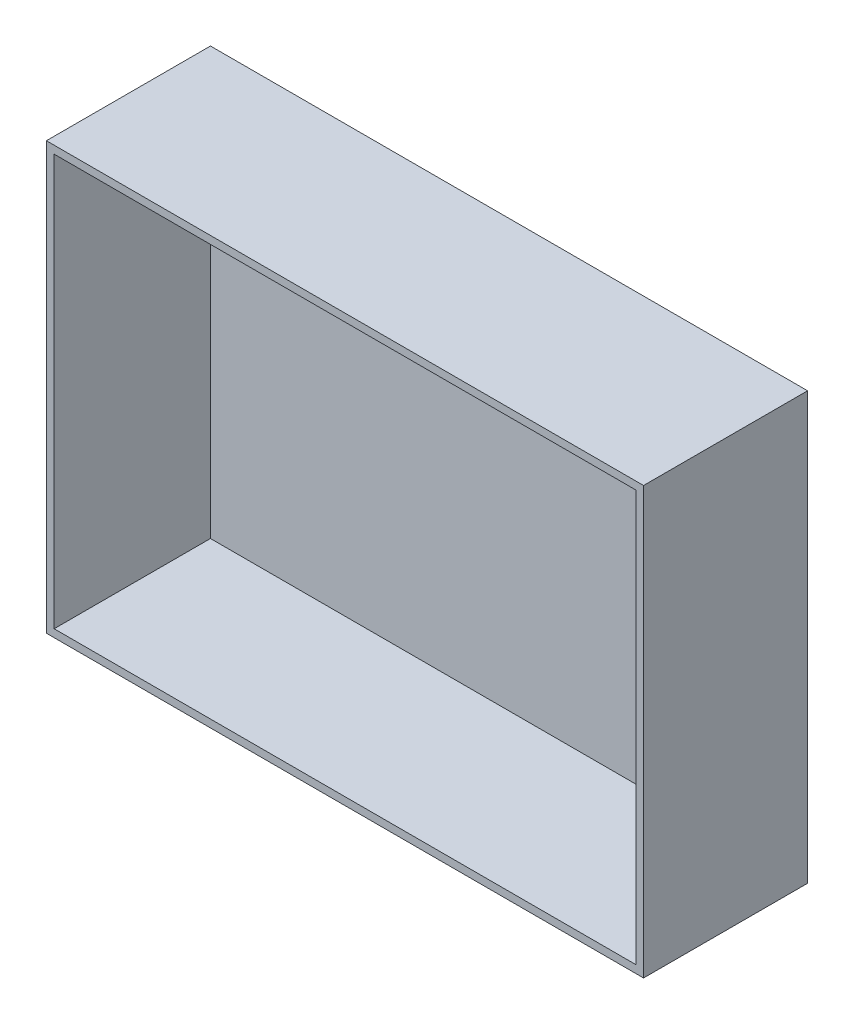
ISO-10303-21;
HEADER;
FILE_DESCRIPTION(('STEP AP214'),'2;1');
FILE_NAME('part.step','',(''),(''),'','','');
FILE_SCHEMA(('AUTOMOTIVE_DESIGN { 1 0 10303 214 1 1 1 1 }'));
ENDSEC;
DATA;
#1=APPLICATION_CONTEXT('core data for automotive mechanical design processes');
#2=APPLICATION_PROTOCOL_DEFINITION('international standard','automotive_design',2000,#1);
#3=PRODUCT_CONTEXT('',#1,'mechanical');
#4=PRODUCT('Part','Part','',(#3));
#5=PRODUCT_RELATED_PRODUCT_CATEGORY('part','',(#4));
#6=PRODUCT_DEFINITION_FORMATION('','',#4);
#7=PRODUCT_DEFINITION_CONTEXT('part definition',#1,'design');
#8=PRODUCT_DEFINITION('design','',#6,#7);
#9=PRODUCT_DEFINITION_SHAPE('','',#8);
#10=(LENGTH_UNIT() NAMED_UNIT(*) SI_UNIT(.MILLI.,.METRE.));
#11=(NAMED_UNIT(*) PLANE_ANGLE_UNIT() SI_UNIT($,.RADIAN.));
#12=(NAMED_UNIT(*) SI_UNIT($,.STERADIAN.) SOLID_ANGLE_UNIT());
#13=UNCERTAINTY_MEASURE_WITH_UNIT(LENGTH_MEASURE(1.E-05),#10,'distance_accuracy_value','');
#14=(GEOMETRIC_REPRESENTATION_CONTEXT(3) GLOBAL_UNCERTAINTY_ASSIGNED_CONTEXT((#13)) GLOBAL_UNIT_ASSIGNED_CONTEXT((#10,
#11,#12)) REPRESENTATION_CONTEXT('',''));
#15=CARTESIAN_POINT('',(0.,0.,0.));
#16=DIRECTION('',(0.,0.,1.));
#17=DIRECTION('',(1.,0.,0.));
#18=AXIS2_PLACEMENT_3D('',#15,#16,#17);
#19=CARTESIAN_POINT('',(0.,0.,63.5));
#20=DIRECTION('',(1.,0.,0.));
#21=DIRECTION('',(0.,0.,-1.));
#22=AXIS2_PLACEMENT_3D('',#19,#20,#21);
#23=PLANE('',#22);
#24=DIRECTION('',(0.,-1.,0.));
#25=VECTOR('',#24,1.);
#26=CARTESIAN_POINT('',(0.,0.,0.));
#27=LINE('',#26,#25);
#28=CARTESIAN_POINT('',(0.,165.1,0.));
#29=VERTEX_POINT('',#28);
#30=CARTESIAN_POINT('',(0.,0.,0.));
#31=VERTEX_POINT('',#30);
#32=EDGE_CURVE('E145',#29,#31,#27,.T.);
#33=ORIENTED_EDGE('',*,*,#32,.T.);
#34=DIRECTION('',(0.,0.,-1.));
#35=VECTOR('',#34,1.);
#36=CARTESIAN_POINT('',(0.,0.,63.5));
#37=LINE('',#36,#35);
#38=CARTESIAN_POINT('',(0.,0.,63.5));
#39=VERTEX_POINT('',#38);
#40=EDGE_CURVE('E13',#39,#31,#37,.T.);
#41=ORIENTED_EDGE('',*,*,#40,.F.);
#42=DIRECTION('',(0.,-1.,0.));
#43=VECTOR('',#42,1.);
#44=CARTESIAN_POINT('',(0.,0.,63.5));
#45=LINE('',#44,#43);
#46=CARTESIAN_POINT('',(0.,165.1,63.5));
#47=VERTEX_POINT('',#46);
#48=EDGE_CURVE('E146',#47,#39,#45,.T.);
#49=ORIENTED_EDGE('',*,*,#48,.F.);
#50=DIRECTION('',(0.,0.,-1.));
#51=VECTOR('',#50,1.);
#52=CARTESIAN_POINT('',(0.,165.1,63.5));
#53=LINE('',#52,#51);
#54=EDGE_CURVE('E78',#47,#29,#53,.T.);
#55=ORIENTED_EDGE('',*,*,#54,.T.);
#56=EDGE_LOOP('',(#33,#41,#49,#55));
#57=FACE_BOUND('',#56,.T.);
#58=ADVANCED_FACE('F35',(#57),#23,.F.);
#59=CARTESIAN_POINT('',(0.,0.,63.5));
#60=DIRECTION('',(0.,1.,0.));
#61=DIRECTION('',(0.,0.,1.));
#62=AXIS2_PLACEMENT_3D('',#59,#60,#61);
#63=PLANE('',#62);
#64=DIRECTION('',(1.,0.,0.));
#65=VECTOR('',#64,1.);
#66=CARTESIAN_POINT('',(0.,0.,0.));
#67=LINE('',#66,#65);
#68=CARTESIAN_POINT('',(231.14,0.,0.));
#69=VERTEX_POINT('',#68);
#70=EDGE_CURVE('E154',#31,#69,#67,.T.);
#71=ORIENTED_EDGE('',*,*,#70,.T.);
#72=DIRECTION('',(0.,0.,-1.));
#73=VECTOR('',#72,1.);
#74=CARTESIAN_POINT('',(231.14,0.,63.5));
#75=LINE('',#74,#73);
#76=CARTESIAN_POINT('',(231.14,0.,63.5));
#77=VERTEX_POINT('',#76);
#78=EDGE_CURVE('E42',#77,#69,#75,.T.);
#79=ORIENTED_EDGE('',*,*,#78,.F.);
#80=DIRECTION('',(1.,0.,0.));
#81=VECTOR('',#80,1.);
#82=CARTESIAN_POINT('',(0.,0.,63.5));
#83=LINE('',#82,#81);
#84=EDGE_CURVE('E85',#39,#77,#83,.T.);
#85=ORIENTED_EDGE('',*,*,#84,.F.);
#86=ORIENTED_EDGE('',*,*,#40,.T.);
#87=EDGE_LOOP('',(#71,#79,#85,#86));
#88=FACE_BOUND('',#87,.T.);
#89=ADVANCED_FACE('F170',(#88),#63,.F.);
#90=CARTESIAN_POINT('',(231.14,0.,63.5));
#91=DIRECTION('',(-1.,0.,0.));
#92=DIRECTION('',(0.,0.,1.));
#93=AXIS2_PLACEMENT_3D('',#90,#91,#92);
#94=PLANE('',#93);
#95=DIRECTION('',(0.,1.,0.));
#96=VECTOR('',#95,1.);
#97=CARTESIAN_POINT('',(231.14,0.,0.));
#98=LINE('',#97,#96);
#99=CARTESIAN_POINT('',(231.14,165.1,0.));
#100=VERTEX_POINT('',#99);
#101=EDGE_CURVE('E157',#69,#100,#98,.T.);
#102=ORIENTED_EDGE('',*,*,#101,.T.);
#103=DIRECTION('',(0.,0.,-1.));
#104=VECTOR('',#103,1.);
#105=CARTESIAN_POINT('',(231.14,165.1,63.5));
#106=LINE('',#105,#104);
#107=CARTESIAN_POINT('',(231.14,165.1,63.5));
#108=VERTEX_POINT('',#107);
#109=EDGE_CURVE('E162',#108,#100,#106,.T.);
#110=ORIENTED_EDGE('',*,*,#109,.F.);
#111=DIRECTION('',(0.,1.,0.));
#112=VECTOR('',#111,1.);
#113=CARTESIAN_POINT('',(231.14,0.,63.5));
#114=LINE('',#113,#112);
#115=EDGE_CURVE('E150',#77,#108,#114,.T.);
#116=ORIENTED_EDGE('',*,*,#115,.F.);
#117=ORIENTED_EDGE('',*,*,#78,.T.);
#118=EDGE_LOOP('',(#102,#110,#116,#117));
#119=FACE_BOUND('',#118,.T.);
#120=ADVANCED_FACE('F165',(#119),#94,.F.);
#121=CARTESIAN_POINT('',(0.,165.1,63.5));
#122=DIRECTION('',(0.,-1.,0.));
#123=DIRECTION('',(0.,0.,-1.));
#124=AXIS2_PLACEMENT_3D('',#121,#122,#123);
#125=PLANE('',#124);
#126=DIRECTION('',(-1.,0.,0.));
#127=VECTOR('',#126,1.);
#128=CARTESIAN_POINT('',(0.,165.1,0.));
#129=LINE('',#128,#127);
#130=EDGE_CURVE('E148',#100,#29,#129,.T.);
#131=ORIENTED_EDGE('',*,*,#130,.T.);
#132=ORIENTED_EDGE('',*,*,#54,.F.);
#133=DIRECTION('',(-1.,0.,0.));
#134=VECTOR('',#133,1.);
#135=CARTESIAN_POINT('',(0.,165.1,63.5));
#136=LINE('',#135,#134);
#137=EDGE_CURVE('E58',#108,#47,#136,.T.);
#138=ORIENTED_EDGE('',*,*,#137,.F.);
#139=ORIENTED_EDGE('',*,*,#109,.T.);
#140=EDGE_LOOP('',(#131,#132,#138,#139));
#141=FACE_BOUND('',#140,.T.);
#142=ADVANCED_FACE('F176',(#141),#125,.F.);
#143=CARTESIAN_POINT('',(0.,0.,63.5));
#144=DIRECTION('',(0.,0.,-1.));
#145=DIRECTION('',(-1.,0.,0.));
#146=AXIS2_PLACEMENT_3D('',#143,#144,#145);
#147=PLANE('',#146);
#148=DIRECTION('',(1.,0.,0.));
#149=VECTOR('',#148,1.);
#150=CARTESIAN_POINT('',(3.,3.,63.5));
#151=LINE('',#150,#149);
#152=CARTESIAN_POINT('',(3.,3.,63.5));
#153=VERTEX_POINT('',#152);
#154=CARTESIAN_POINT('',(228.14,3.,63.5));
#155=VERTEX_POINT('',#154);
#156=EDGE_CURVE('E131',#153,#155,#151,.T.);
#157=ORIENTED_EDGE('',*,*,#156,.F.);
#158=DIRECTION('',(0.,-1.,0.));
#159=VECTOR('',#158,1.);
#160=CARTESIAN_POINT('',(3.,162.1,63.5));
#161=LINE('',#160,#159);
#162=CARTESIAN_POINT('',(3.,162.1,63.5));
#163=VERTEX_POINT('',#162);
#164=EDGE_CURVE('E124',#163,#153,#161,.T.);
#165=ORIENTED_EDGE('',*,*,#164,.F.);
#166=DIRECTION('',(-1.,0.,0.));
#167=VECTOR('',#166,1.);
#168=CARTESIAN_POINT('',(3.,162.1,63.5));
#169=LINE('',#168,#167);
#170=CARTESIAN_POINT('',(228.14,162.1,63.5));
#171=VERTEX_POINT('',#170);
#172=EDGE_CURVE('E135',#171,#163,#169,.T.);
#173=ORIENTED_EDGE('',*,*,#172,.F.);
#174=DIRECTION('',(0.,1.,0.));
#175=VECTOR('',#174,1.);
#176=CARTESIAN_POINT('',(228.14,162.1,63.5));
#177=LINE('',#176,#175);
#178=EDGE_CURVE('E49',#155,#171,#177,.T.);
#179=ORIENTED_EDGE('',*,*,#178,.F.);
#180=EDGE_LOOP('',(#157,#165,#173,#179));
#181=FACE_BOUND('',#180,.T.);
#182=ORIENTED_EDGE('',*,*,#48,.T.);
#183=ORIENTED_EDGE('',*,*,#84,.T.);
#184=ORIENTED_EDGE('',*,*,#115,.T.);
#185=ORIENTED_EDGE('',*,*,#137,.T.);
#186=EDGE_LOOP('',(#182,#183,#184,#185));
#187=FACE_BOUND('',#186,.T.);
#188=ADVANCED_FACE('F177',(#181,#187),#147,.F.);
#189=CARTESIAN_POINT('',(0.,0.,0.));
#190=DIRECTION('',(0.,0.,-1.));
#191=DIRECTION('',(-1.,0.,0.));
#192=AXIS2_PLACEMENT_3D('',#189,#190,#191);
#193=PLANE('',#192);
#194=ORIENTED_EDGE('',*,*,#32,.F.);
#195=ORIENTED_EDGE('',*,*,#130,.F.);
#196=ORIENTED_EDGE('',*,*,#101,.F.);
#197=ORIENTED_EDGE('',*,*,#70,.F.);
#198=EDGE_LOOP('',(#194,#195,#196,#197));
#199=FACE_BOUND('',#198,.T.);
#200=ADVANCED_FACE('F174',(#199),#193,.T.);
#201=CARTESIAN_POINT('',(0.,0.,3.));
#202=DIRECTION('',(0.,0.,-1.));
#203=DIRECTION('',(-1.,0.,0.));
#204=AXIS2_PLACEMENT_3D('',#201,#202,#203);
#205=PLANE('',#204);
#206=DIRECTION('',(-1.,0.,0.));
#207=VECTOR('',#206,1.);
#208=CARTESIAN_POINT('',(3.,162.1,3.));
#209=LINE('',#208,#207);
#210=CARTESIAN_POINT('',(228.14,162.1,3.));
#211=VERTEX_POINT('',#210);
#212=CARTESIAN_POINT('',(3.,162.1,3.));
#213=VERTEX_POINT('',#212);
#214=EDGE_CURVE('E128',#211,#213,#209,.T.);
#215=ORIENTED_EDGE('',*,*,#214,.T.);
#216=DIRECTION('',(0.,-1.,0.));
#217=VECTOR('',#216,1.);
#218=CARTESIAN_POINT('',(3.,162.1,3.));
#219=LINE('',#218,#217);
#220=CARTESIAN_POINT('',(3.,3.,2.99999999999989));
#221=VERTEX_POINT('',#220);
#222=EDGE_CURVE('E121',#213,#221,#219,.T.);
#223=ORIENTED_EDGE('',*,*,#222,.T.);
#224=DIRECTION('',(1.,0.,0.));
#225=VECTOR('',#224,1.);
#226=CARTESIAN_POINT('',(3.,3.,3.));
#227=LINE('',#226,#225);
#228=CARTESIAN_POINT('',(228.14,3.,3.));
#229=VERTEX_POINT('',#228);
#230=EDGE_CURVE('E108',#221,#229,#227,.T.);
#231=ORIENTED_EDGE('',*,*,#230,.T.);
#232=DIRECTION('',(0.,1.,0.));
#233=VECTOR('',#232,1.);
#234=CARTESIAN_POINT('',(228.14,162.1,3.));
#235=LINE('',#234,#233);
#236=EDGE_CURVE('E140',#229,#211,#235,.T.);
#237=ORIENTED_EDGE('',*,*,#236,.T.);
#238=EDGE_LOOP('',(#215,#223,#231,#237));
#239=FACE_BOUND('',#238,.T.);
#240=ADVANCED_FACE('F127',(#239),#205,.F.);
#241=CARTESIAN_POINT('',(3.,162.1,-290.013022692836));
#242=DIRECTION('',(-1.,0.,0.));
#243=DIRECTION('',(0.,0.,1.));
#244=AXIS2_PLACEMENT_3D('',#241,#242,#243);
#245=PLANE('',#244);
#246=DIRECTION('',(0.,0.,1.));
#247=VECTOR('',#246,1.);
#248=CARTESIAN_POINT('',(3.,162.1,-290.013022692836));
#249=LINE('',#248,#247);
#250=EDGE_CURVE('E138',#213,#163,#249,.T.);
#251=ORIENTED_EDGE('',*,*,#250,.T.);
#252=ORIENTED_EDGE('',*,*,#164,.T.);
#253=DIRECTION('',(0.,0.,1.));
#254=VECTOR('',#253,1.);
#255=CARTESIAN_POINT('',(3.,3.,-290.013022692836));
#256=LINE('',#255,#254);
#257=EDGE_CURVE('E112',#221,#153,#256,.T.);
#258=ORIENTED_EDGE('',*,*,#257,.F.);
#259=ORIENTED_EDGE('',*,*,#222,.F.);
#260=EDGE_LOOP('',(#251,#252,#258,#259));
#261=FACE_BOUND('',#260,.T.);
#262=ADVANCED_FACE('F120',(#261),#245,.F.);
#263=CARTESIAN_POINT('',(3.,3.,-290.013022692836));
#264=DIRECTION('',(0.,-1.,0.));
#265=DIRECTION('',(1.,0.,0.));
#266=AXIS2_PLACEMENT_3D('',#263,#264,#265);
#267=PLANE('',#266);
#268=ORIENTED_EDGE('',*,*,#257,.T.);
#269=ORIENTED_EDGE('',*,*,#156,.T.);
#270=DIRECTION('',(0.,0.,1.));
#271=VECTOR('',#270,1.);
#272=CARTESIAN_POINT('',(228.14,3.,-290.013022692836));
#273=LINE('',#272,#271);
#274=EDGE_CURVE('E114',#229,#155,#273,.T.);
#275=ORIENTED_EDGE('',*,*,#274,.F.);
#276=ORIENTED_EDGE('',*,*,#230,.F.);
#277=EDGE_LOOP('',(#268,#269,#275,#276));
#278=FACE_BOUND('',#277,.T.);
#279=ADVANCED_FACE('F110',(#278),#267,.F.);
#280=CARTESIAN_POINT('',(228.14,162.1,-290.013022692836));
#281=DIRECTION('',(1.,0.,0.));
#282=DIRECTION('',(0.,0.,-1.));
#283=AXIS2_PLACEMENT_3D('',#280,#281,#282);
#284=PLANE('',#283);
#285=ORIENTED_EDGE('',*,*,#274,.T.);
#286=ORIENTED_EDGE('',*,*,#178,.T.);
#287=DIRECTION('',(0.,0.,1.));
#288=VECTOR('',#287,1.);
#289=CARTESIAN_POINT('',(228.14,162.1,-290.013022692836));
#290=LINE('',#289,#288);
#291=EDGE_CURVE('E139',#211,#171,#290,.T.);
#292=ORIENTED_EDGE('',*,*,#291,.F.);
#293=ORIENTED_EDGE('',*,*,#236,.F.);
#294=EDGE_LOOP('',(#285,#286,#292,#293));
#295=FACE_BOUND('',#294,.T.);
#296=ADVANCED_FACE('F231',(#295),#284,.F.);
#297=CARTESIAN_POINT('',(3.,162.1,-290.013022692836));
#298=DIRECTION('',(0.,1.,0.));
#299=DIRECTION('',(0.,0.,1.));
#300=AXIS2_PLACEMENT_3D('',#297,#298,#299);
#301=PLANE('',#300);
#302=ORIENTED_EDGE('',*,*,#291,.T.);
#303=ORIENTED_EDGE('',*,*,#172,.T.);
#304=ORIENTED_EDGE('',*,*,#250,.F.);
#305=ORIENTED_EDGE('',*,*,#214,.F.);
#306=EDGE_LOOP('',(#302,#303,#304,#305));
#307=FACE_BOUND('',#306,.T.);
#308=ADVANCED_FACE('F240',(#307),#301,.F.);
#309=CLOSED_SHELL('',(#58,#89,#120,#142,#188,#200,#240,#262,#279,#296,#308));
#310=MANIFOLD_SOLID_BREP('B2',#309);
#311=ADVANCED_BREP_SHAPE_REPRESENTATION('',(#18,#310),#14);
#312=SHAPE_DEFINITION_REPRESENTATION(#9,#311);
ENDSEC;
END-ISO-10303-21;
